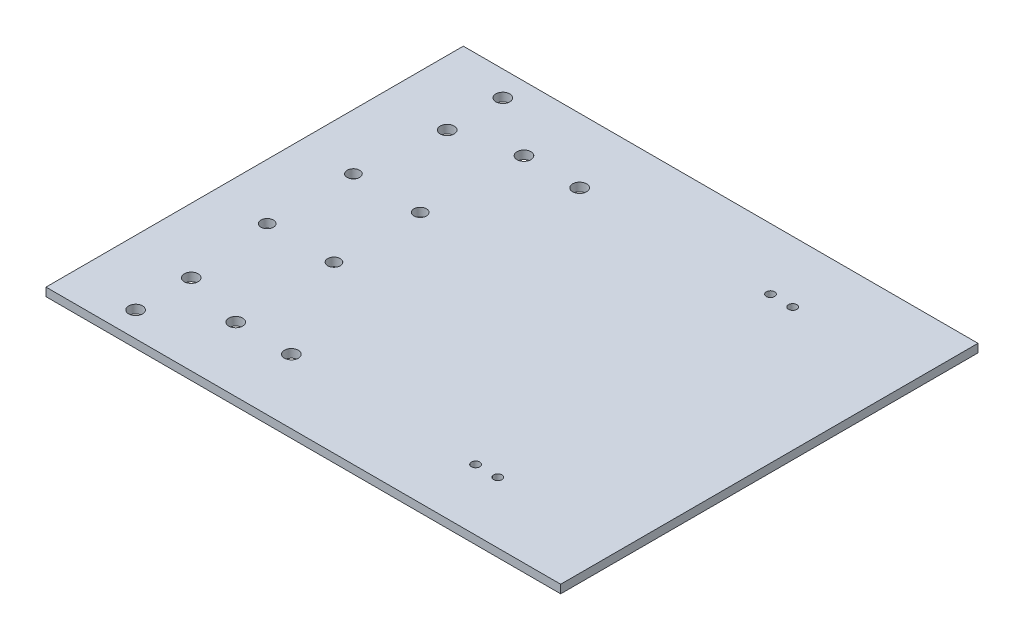
ISO-10303-21;
HEADER;
FILE_DESCRIPTION(('STEP AP214'),'2;1');
FILE_NAME('part.step','',(''),(''),'','','');
FILE_SCHEMA(('AUTOMOTIVE_DESIGN { 1 0 10303 214 1 1 1 1 }'));
ENDSEC;
DATA;
#1=APPLICATION_CONTEXT('core data for automotive mechanical design processes');
#2=APPLICATION_PROTOCOL_DEFINITION('international standard','automotive_design',2000,#1);
#3=PRODUCT_CONTEXT('',#1,'mechanical');
#4=PRODUCT('Part','Part','',(#3));
#5=PRODUCT_RELATED_PRODUCT_CATEGORY('part','',(#4));
#6=PRODUCT_DEFINITION_FORMATION('','',#4);
#7=PRODUCT_DEFINITION_CONTEXT('part definition',#1,'design');
#8=PRODUCT_DEFINITION('design','',#6,#7);
#9=PRODUCT_DEFINITION_SHAPE('','',#8);
#10=(LENGTH_UNIT() NAMED_UNIT(*) SI_UNIT(.MILLI.,.METRE.));
#11=(NAMED_UNIT(*) PLANE_ANGLE_UNIT() SI_UNIT($,.RADIAN.));
#12=(NAMED_UNIT(*) SI_UNIT($,.STERADIAN.) SOLID_ANGLE_UNIT());
#13=UNCERTAINTY_MEASURE_WITH_UNIT(LENGTH_MEASURE(1.E-05),#10,'distance_accuracy_value','');
#14=(GEOMETRIC_REPRESENTATION_CONTEXT(3) GLOBAL_UNCERTAINTY_ASSIGNED_CONTEXT((#13)) GLOBAL_UNIT_ASSIGNED_CONTEXT((#10,
#11,#12)) REPRESENTATION_CONTEXT('',''));
#15=CARTESIAN_POINT('',(0.,0.,0.));
#16=DIRECTION('',(0.,0.,1.));
#17=DIRECTION('',(1.,0.,0.));
#18=AXIS2_PLACEMENT_3D('',#15,#16,#17);
#19=CARTESIAN_POINT('',(0.,3.,0.));
#20=DIRECTION('',(1.,0.,0.));
#21=DIRECTION('',(0.,0.,-1.));
#22=AXIS2_PLACEMENT_3D('',#19,#20,#21);
#23=PLANE('',#22);
#24=DIRECTION('',(0.,0.,1.));
#25=VECTOR('',#24,1.);
#26=CARTESIAN_POINT('',(0.,0.,0.));
#27=LINE('',#26,#25);
#28=CARTESIAN_POINT('',(0.,0.,-150.));
#29=VERTEX_POINT('',#28);
#30=CARTESIAN_POINT('',(0.,0.,0.));
#31=VERTEX_POINT('',#30);
#32=EDGE_CURVE('E110',#29,#31,#27,.T.);
#33=ORIENTED_EDGE('',*,*,#32,.T.);
#34=DIRECTION('',(0.,-1.,0.));
#35=VECTOR('',#34,1.);
#36=CARTESIAN_POINT('',(0.,3.,0.));
#37=LINE('',#36,#35);
#38=CARTESIAN_POINT('',(0.,3.,0.));
#39=VERTEX_POINT('',#38);
#40=EDGE_CURVE('E11',#39,#31,#37,.T.);
#41=ORIENTED_EDGE('',*,*,#40,.F.);
#42=DIRECTION('',(0.,0.,1.));
#43=VECTOR('',#42,1.);
#44=CARTESIAN_POINT('',(0.,3.,0.));
#45=LINE('',#44,#43);
#46=CARTESIAN_POINT('',(0.,3.,-150.));
#47=VERTEX_POINT('',#46);
#48=EDGE_CURVE('E93',#47,#39,#45,.T.);
#49=ORIENTED_EDGE('',*,*,#48,.F.);
#50=DIRECTION('',(0.,-1.,0.));
#51=VECTOR('',#50,1.);
#52=CARTESIAN_POINT('',(0.,3.,-150.));
#53=LINE('',#52,#51);
#54=EDGE_CURVE('E106',#47,#29,#53,.T.);
#55=ORIENTED_EDGE('',*,*,#54,.T.);
#56=EDGE_LOOP('',(#33,#41,#49,#55));
#57=FACE_BOUND('',#56,.T.);
#58=ADVANCED_FACE('F39',(#57),#23,.F.);
#59=CARTESIAN_POINT('',(0.,3.,0.));
#60=DIRECTION('',(0.,0.,-1.));
#61=DIRECTION('',(-1.,0.,0.));
#62=AXIS2_PLACEMENT_3D('',#59,#60,#61);
#63=PLANE('',#62);
#64=DIRECTION('',(1.,0.,0.));
#65=VECTOR('',#64,1.);
#66=CARTESIAN_POINT('',(0.,0.,0.));
#67=LINE('',#66,#65);
#68=CARTESIAN_POINT('',(185.,0.,0.));
#69=VERTEX_POINT('',#68);
#70=EDGE_CURVE('E98',#31,#69,#67,.T.);
#71=ORIENTED_EDGE('',*,*,#70,.T.);
#72=DIRECTION('',(0.,-1.,0.));
#73=VECTOR('',#72,1.);
#74=CARTESIAN_POINT('',(185.,3.,0.));
#75=LINE('',#74,#73);
#76=CARTESIAN_POINT('',(185.,3.,0.));
#77=VERTEX_POINT('',#76);
#78=EDGE_CURVE('E49',#77,#69,#75,.T.);
#79=ORIENTED_EDGE('',*,*,#78,.F.);
#80=DIRECTION('',(1.,0.,0.));
#81=VECTOR('',#80,1.);
#82=CARTESIAN_POINT('',(0.,3.,0.));
#83=LINE('',#82,#81);
#84=EDGE_CURVE('E88',#39,#77,#83,.T.);
#85=ORIENTED_EDGE('',*,*,#84,.F.);
#86=ORIENTED_EDGE('',*,*,#40,.T.);
#87=EDGE_LOOP('',(#71,#79,#85,#86));
#88=FACE_BOUND('',#87,.T.);
#89=ADVANCED_FACE('F97',(#88),#63,.F.);
#90=CARTESIAN_POINT('',(185.,3.,0.));
#91=DIRECTION('',(-1.,0.,0.));
#92=DIRECTION('',(0.,0.,1.));
#93=AXIS2_PLACEMENT_3D('',#90,#91,#92);
#94=PLANE('',#93);
#95=DIRECTION('',(0.,0.,-1.));
#96=VECTOR('',#95,1.);
#97=CARTESIAN_POINT('',(185.,0.,0.));
#98=LINE('',#97,#96);
#99=CARTESIAN_POINT('',(185.,0.,-150.));
#100=VERTEX_POINT('',#99);
#101=EDGE_CURVE('E75',#69,#100,#98,.T.);
#102=ORIENTED_EDGE('',*,*,#101,.T.);
#103=DIRECTION('',(0.,-1.,0.));
#104=VECTOR('',#103,1.);
#105=CARTESIAN_POINT('',(185.,3.,-150.));
#106=LINE('',#105,#104);
#107=CARTESIAN_POINT('',(185.,3.,-150.));
#108=VERTEX_POINT('',#107);
#109=EDGE_CURVE('E100',#108,#100,#106,.T.);
#110=ORIENTED_EDGE('',*,*,#109,.F.);
#111=DIRECTION('',(0.,0.,-1.));
#112=VECTOR('',#111,1.);
#113=CARTESIAN_POINT('',(185.,3.,0.));
#114=LINE('',#113,#112);
#115=EDGE_CURVE('E91',#77,#108,#114,.T.);
#116=ORIENTED_EDGE('',*,*,#115,.F.);
#117=ORIENTED_EDGE('',*,*,#78,.T.);
#118=EDGE_LOOP('',(#102,#110,#116,#117));
#119=FACE_BOUND('',#118,.T.);
#120=ADVANCED_FACE('F102',(#119),#94,.F.);
#121=CARTESIAN_POINT('',(0.,3.,-150.));
#122=DIRECTION('',(0.,0.,1.));
#123=DIRECTION('',(1.,0.,0.));
#124=AXIS2_PLACEMENT_3D('',#121,#122,#123);
#125=PLANE('',#124);
#126=DIRECTION('',(-1.,0.,0.));
#127=VECTOR('',#126,1.);
#128=CARTESIAN_POINT('',(0.,0.,-150.));
#129=LINE('',#128,#127);
#130=EDGE_CURVE('E81',#100,#29,#129,.T.);
#131=ORIENTED_EDGE('',*,*,#130,.T.);
#132=ORIENTED_EDGE('',*,*,#54,.F.);
#133=DIRECTION('',(-1.,0.,0.));
#134=VECTOR('',#133,1.);
#135=CARTESIAN_POINT('',(0.,3.,-150.));
#136=LINE('',#135,#134);
#137=EDGE_CURVE('E58',#108,#47,#136,.T.);
#138=ORIENTED_EDGE('',*,*,#137,.F.);
#139=ORIENTED_EDGE('',*,*,#109,.T.);
#140=EDGE_LOOP('',(#131,#132,#138,#139));
#141=FACE_BOUND('',#140,.T.);
#142=ADVANCED_FACE('F228',(#141),#125,.F.);
#143=CARTESIAN_POINT('',(0.,3.,0.));
#144=DIRECTION('',(0.,-1.,0.));
#145=DIRECTION('',(0.,0.,-1.));
#146=AXIS2_PLACEMENT_3D('',#143,#144,#145);
#147=PLANE('',#146);
#148=CARTESIAN_POINT('',(44.,3.,-90.5));
#149=DIRECTION('',(0.,1.,0.));
#150=DIRECTION('',(0.,0.,1.));
#151=AXIS2_PLACEMENT_3D('',#148,#149,#150);
#152=CIRCLE('',#151,2.25);
#153=CARTESIAN_POINT('',(44.,3.,-88.25));
#154=VERTEX_POINT('',#153);
#155=EDGE_CURVE('E430',#154,#154,#152,.T.);
#156=ORIENTED_EDGE('',*,*,#155,.F.);
#157=EDGE_LOOP('',(#156));
#158=FACE_BOUND('',#157,.T.);
#159=CARTESIAN_POINT('',(44.,3.,-59.5));
#160=DIRECTION('',(0.,1.,0.));
#161=DIRECTION('',(0.,0.,-1.));
#162=AXIS2_PLACEMENT_3D('',#159,#160,#161);
#163=CIRCLE('',#162,2.25);
#164=CARTESIAN_POINT('',(44.,3.,-61.75));
#165=VERTEX_POINT('',#164);
#166=EDGE_CURVE('E427',#165,#165,#163,.T.);
#167=ORIENTED_EDGE('',*,*,#166,.F.);
#168=EDGE_LOOP('',(#167));
#169=FACE_BOUND('',#168,.T.);
#170=CARTESIAN_POINT('',(20.,3.,-59.5));
#171=DIRECTION('',(0.,1.,0.));
#172=DIRECTION('',(0.,0.,-1.));
#173=AXIS2_PLACEMENT_3D('',#170,#171,#172);
#174=CIRCLE('',#173,2.25);
#175=CARTESIAN_POINT('',(20.,3.,-61.75));
#176=VERTEX_POINT('',#175);
#177=EDGE_CURVE('E431',#176,#176,#174,.T.);
#178=ORIENTED_EDGE('',*,*,#177,.F.);
#179=EDGE_LOOP('',(#178));
#180=FACE_BOUND('',#179,.T.);
#181=CARTESIAN_POINT('',(45.,3.,-23.2));
#182=DIRECTION('',(0.,1.,0.));
#183=DIRECTION('',(0.,0.,1.));
#184=AXIS2_PLACEMENT_3D('',#181,#182,#183);
#185=CIRCLE('',#184,2.5);
#186=CARTESIAN_POINT('',(45.,3.,-20.7));
#187=VERTEX_POINT('',#186);
#188=EDGE_CURVE('E439',#187,#187,#185,.T.);
#189=ORIENTED_EDGE('',*,*,#188,.F.);
#190=EDGE_LOOP('',(#189));
#191=FACE_BOUND('',#190,.T.);
#192=CARTESIAN_POINT('',(132.4,3.,-128.));
#193=DIRECTION('',(0.,1.,0.));
#194=DIRECTION('',(0.,0.,1.));
#195=AXIS2_PLACEMENT_3D('',#192,#193,#194);
#196=CIRCLE('',#195,1.5);
#197=CARTESIAN_POINT('',(132.4,3.,-126.5));
#198=VERTEX_POINT('',#197);
#199=EDGE_CURVE('E451',#198,#198,#196,.T.);
#200=ORIENTED_EDGE('',*,*,#199,.F.);
#201=EDGE_LOOP('',(#200));
#202=FACE_BOUND('',#201,.T.);
#203=CARTESIAN_POINT('',(132.4,3.,-22.));
#204=DIRECTION('',(0.,1.,0.));
#205=DIRECTION('',(0.,0.,-1.));
#206=AXIS2_PLACEMENT_3D('',#203,#204,#205);
#207=CIRCLE('',#206,1.5);
#208=CARTESIAN_POINT('',(132.4,3.,-23.5));
#209=VERTEX_POINT('',#208);
#210=EDGE_CURVE('E447',#209,#209,#207,.T.);
#211=ORIENTED_EDGE('',*,*,#210,.F.);
#212=EDGE_LOOP('',(#211));
#213=FACE_BOUND('',#212,.T.);
#214=CARTESIAN_POINT('',(140.4,3.,-22.));
#215=DIRECTION('',(0.,1.,0.));
#216=DIRECTION('',(0.,0.,-1.));
#217=AXIS2_PLACEMENT_3D('',#214,#215,#216);
#218=CIRCLE('',#217,1.5);
#219=CARTESIAN_POINT('',(140.4,3.,-23.5));
#220=VERTEX_POINT('',#219);
#221=EDGE_CURVE('E443',#220,#220,#218,.T.);
#222=ORIENTED_EDGE('',*,*,#221,.F.);
#223=EDGE_LOOP('',(#222));
#224=FACE_BOUND('',#223,.T.);
#225=CARTESIAN_POINT('',(20.,3.,-90.5));
#226=DIRECTION('',(0.,1.,0.));
#227=DIRECTION('',(0.,0.,1.));
#228=AXIS2_PLACEMENT_3D('',#225,#226,#227);
#229=CIRCLE('',#228,2.25);
#230=CARTESIAN_POINT('',(20.,3.,-88.25));
#231=VERTEX_POINT('',#230);
#232=EDGE_CURVE('E436',#231,#231,#229,.T.);
#233=ORIENTED_EDGE('',*,*,#232,.F.);
#234=EDGE_LOOP('',(#233));
#235=FACE_BOUND('',#234,.T.);
#236=CARTESIAN_POINT('',(23.2,3.,-141.));
#237=DIRECTION('',(0.,1.,0.));
#238=DIRECTION('',(0.,0.,-1.));
#239=AXIS2_PLACEMENT_3D('',#236,#237,#238);
#240=CIRCLE('',#239,2.5);
#241=CARTESIAN_POINT('',(23.2,3.,-143.5));
#242=VERTEX_POINT('',#241);
#243=EDGE_CURVE('E475',#242,#242,#240,.T.);
#244=ORIENTED_EDGE('',*,*,#243,.F.);
#245=EDGE_LOOP('',(#244));
#246=FACE_BOUND('',#245,.T.);
#247=CARTESIAN_POINT('',(23.2,3.,-121.));
#248=DIRECTION('',(0.,1.,0.));
#249=DIRECTION('',(0.,0.,-1.));
#250=AXIS2_PLACEMENT_3D('',#247,#248,#249);
#251=CIRCLE('',#250,2.5);
#252=CARTESIAN_POINT('',(23.2,3.,-123.5));
#253=VERTEX_POINT('',#252);
#254=EDGE_CURVE('E479',#253,#253,#251,.T.);
#255=ORIENTED_EDGE('',*,*,#254,.F.);
#256=EDGE_LOOP('',(#255));
#257=FACE_BOUND('',#256,.T.);
#258=CARTESIAN_POINT('',(23.2,3.,-29.));
#259=DIRECTION('',(0.,1.,0.));
#260=DIRECTION('',(0.,0.,1.));
#261=AXIS2_PLACEMENT_3D('',#258,#259,#260);
#262=CIRCLE('',#261,2.5);
#263=CARTESIAN_POINT('',(23.2,3.,-26.5));
#264=VERTEX_POINT('',#263);
#265=EDGE_CURVE('E483',#264,#264,#262,.T.);
#266=ORIENTED_EDGE('',*,*,#265,.F.);
#267=EDGE_LOOP('',(#266));
#268=FACE_BOUND('',#267,.T.);
#269=CARTESIAN_POINT('',(45.,3.,-126.8));
#270=DIRECTION('',(0.,1.,0.));
#271=DIRECTION('',(0.,0.,-1.));
#272=AXIS2_PLACEMENT_3D('',#269,#270,#271);
#273=CIRCLE('',#272,2.5);
#274=CARTESIAN_POINT('',(45.,3.,-129.3));
#275=VERTEX_POINT('',#274);
#276=EDGE_CURVE('E487',#275,#275,#273,.T.);
#277=ORIENTED_EDGE('',*,*,#276,.F.);
#278=EDGE_LOOP('',(#277));
#279=FACE_BOUND('',#278,.T.);
#280=CARTESIAN_POINT('',(65.,3.,-126.8));
#281=DIRECTION('',(0.,1.,0.));
#282=DIRECTION('',(0.,0.,-1.));
#283=AXIS2_PLACEMENT_3D('',#280,#281,#282);
#284=CIRCLE('',#283,2.5);
#285=CARTESIAN_POINT('',(65.,3.,-129.3));
#286=VERTEX_POINT('',#285);
#287=EDGE_CURVE('E491',#286,#286,#284,.T.);
#288=ORIENTED_EDGE('',*,*,#287,.F.);
#289=EDGE_LOOP('',(#288));
#290=FACE_BOUND('',#289,.T.);
#291=CARTESIAN_POINT('',(23.2,3.,-9.00000000000001));
#292=DIRECTION('',(0.,1.,0.));
#293=DIRECTION('',(0.,0.,1.));
#294=AXIS2_PLACEMENT_3D('',#291,#292,#293);
#295=CIRCLE('',#294,2.5);
#296=CARTESIAN_POINT('',(23.2,3.,-6.50000000000001));
#297=VERTEX_POINT('',#296);
#298=EDGE_CURVE('E495',#297,#297,#295,.T.);
#299=ORIENTED_EDGE('',*,*,#298,.F.);
#300=EDGE_LOOP('',(#299));
#301=FACE_BOUND('',#300,.T.);
#302=CARTESIAN_POINT('',(65.,3.,-23.2));
#303=DIRECTION('',(0.,1.,0.));
#304=DIRECTION('',(0.,0.,1.));
#305=AXIS2_PLACEMENT_3D('',#302,#303,#304);
#306=CIRCLE('',#305,2.5);
#307=CARTESIAN_POINT('',(65.,3.,-20.7));
#308=VERTEX_POINT('',#307);
#309=EDGE_CURVE('E498',#308,#308,#306,.T.);
#310=ORIENTED_EDGE('',*,*,#309,.F.);
#311=EDGE_LOOP('',(#310));
#312=FACE_BOUND('',#311,.T.);
#313=CARTESIAN_POINT('',(140.4,3.,-128.));
#314=DIRECTION('',(0.,1.,0.));
#315=DIRECTION('',(0.,0.,1.));
#316=AXIS2_PLACEMENT_3D('',#313,#314,#315);
#317=CIRCLE('',#316,1.5);
#318=CARTESIAN_POINT('',(140.4,3.,-126.5));
#319=VERTEX_POINT('',#318);
#320=EDGE_CURVE('E129',#319,#319,#317,.T.);
#321=ORIENTED_EDGE('',*,*,#320,.F.);
#322=EDGE_LOOP('',(#321));
#323=FACE_BOUND('',#322,.T.);
#324=ORIENTED_EDGE('',*,*,#48,.T.);
#325=ORIENTED_EDGE('',*,*,#84,.T.);
#326=ORIENTED_EDGE('',*,*,#115,.T.);
#327=ORIENTED_EDGE('',*,*,#137,.T.);
#328=EDGE_LOOP('',(#324,#325,#326,#327));
#329=FACE_BOUND('',#328,.T.);
#330=ADVANCED_FACE('F89',(#158,#169,#180,#191,#202,#213,#224,#235,#246,#257,#268,#279,#290,#301,
#312,#323,#329),#147,.F.);
#331=CARTESIAN_POINT('',(0.,0.,0.));
#332=DIRECTION('',(0.,-1.,0.));
#333=DIRECTION('',(0.,0.,-1.));
#334=AXIS2_PLACEMENT_3D('',#331,#332,#333);
#335=PLANE('',#334);
#336=CARTESIAN_POINT('',(44.,0.,-90.5));
#337=DIRECTION('',(0.,-1.,0.));
#338=DIRECTION('',(0.,0.,-1.));
#339=AXIS2_PLACEMENT_3D('',#336,#337,#338);
#340=CIRCLE('',#339,2.25);
#341=CARTESIAN_POINT('',(44.,0.,-92.75));
#342=VERTEX_POINT('',#341);
#343=EDGE_CURVE('E42',#342,#342,#340,.T.);
#344=ORIENTED_EDGE('',*,*,#343,.F.);
#345=EDGE_LOOP('',(#344));
#346=FACE_BOUND('',#345,.T.);
#347=CARTESIAN_POINT('',(44.,0.,-59.5));
#348=DIRECTION('',(0.,-1.,0.));
#349=DIRECTION('',(0.,0.,-1.));
#350=AXIS2_PLACEMENT_3D('',#347,#348,#349);
#351=CIRCLE('',#350,2.25);
#352=CARTESIAN_POINT('',(44.,0.,-61.75));
#353=VERTEX_POINT('',#352);
#354=EDGE_CURVE('E180',#353,#353,#351,.T.);
#355=ORIENTED_EDGE('',*,*,#354,.F.);
#356=EDGE_LOOP('',(#355));
#357=FACE_BOUND('',#356,.T.);
#358=CARTESIAN_POINT('',(20.,0.,-59.5));
#359=DIRECTION('',(0.,-1.,0.));
#360=DIRECTION('',(0.,0.,-1.));
#361=AXIS2_PLACEMENT_3D('',#358,#359,#360);
#362=CIRCLE('',#361,2.25);
#363=CARTESIAN_POINT('',(20.,0.,-61.75));
#364=VERTEX_POINT('',#363);
#365=EDGE_CURVE('E177',#364,#364,#362,.T.);
#366=ORIENTED_EDGE('',*,*,#365,.F.);
#367=EDGE_LOOP('',(#366));
#368=FACE_BOUND('',#367,.T.);
#369=CARTESIAN_POINT('',(45.,0.,-23.2));
#370=DIRECTION('',(0.,-1.,0.));
#371=DIRECTION('',(0.,0.,-1.));
#372=AXIS2_PLACEMENT_3D('',#369,#370,#371);
#373=CIRCLE('',#372,2.5);
#374=CARTESIAN_POINT('',(45.,0.,-25.7));
#375=VERTEX_POINT('',#374);
#376=EDGE_CURVE('E173',#375,#375,#373,.T.);
#377=ORIENTED_EDGE('',*,*,#376,.F.);
#378=EDGE_LOOP('',(#377));
#379=FACE_BOUND('',#378,.T.);
#380=CARTESIAN_POINT('',(132.4,0.,-128.));
#381=DIRECTION('',(0.,-1.,0.));
#382=DIRECTION('',(0.,0.,-1.));
#383=AXIS2_PLACEMENT_3D('',#380,#381,#382);
#384=CIRCLE('',#383,1.5);
#385=CARTESIAN_POINT('',(132.4,0.,-129.5));
#386=VERTEX_POINT('',#385);
#387=EDGE_CURVE('E169',#386,#386,#384,.T.);
#388=ORIENTED_EDGE('',*,*,#387,.F.);
#389=EDGE_LOOP('',(#388));
#390=FACE_BOUND('',#389,.T.);
#391=CARTESIAN_POINT('',(132.4,0.,-22.));
#392=DIRECTION('',(0.,-1.,0.));
#393=DIRECTION('',(0.,0.,-1.));
#394=AXIS2_PLACEMENT_3D('',#391,#392,#393);
#395=CIRCLE('',#394,1.5);
#396=CARTESIAN_POINT('',(132.4,0.,-23.5));
#397=VERTEX_POINT('',#396);
#398=EDGE_CURVE('E165',#397,#397,#395,.T.);
#399=ORIENTED_EDGE('',*,*,#398,.F.);
#400=EDGE_LOOP('',(#399));
#401=FACE_BOUND('',#400,.T.);
#402=CARTESIAN_POINT('',(140.4,0.,-22.));
#403=DIRECTION('',(0.,-1.,0.));
#404=DIRECTION('',(0.,0.,-1.));
#405=AXIS2_PLACEMENT_3D('',#402,#403,#404);
#406=CIRCLE('',#405,1.5);
#407=CARTESIAN_POINT('',(140.4,0.,-23.5));
#408=VERTEX_POINT('',#407);
#409=EDGE_CURVE('E161',#408,#408,#406,.T.);
#410=ORIENTED_EDGE('',*,*,#409,.F.);
#411=EDGE_LOOP('',(#410));
#412=FACE_BOUND('',#411,.T.);
#413=CARTESIAN_POINT('',(20.,0.,-90.5));
#414=DIRECTION('',(0.,-1.,0.));
#415=DIRECTION('',(0.,0.,-1.));
#416=AXIS2_PLACEMENT_3D('',#413,#414,#415);
#417=CIRCLE('',#416,2.25);
#418=CARTESIAN_POINT('',(20.,0.,-92.75));
#419=VERTEX_POINT('',#418);
#420=EDGE_CURVE('E157',#419,#419,#417,.T.);
#421=ORIENTED_EDGE('',*,*,#420,.F.);
#422=EDGE_LOOP('',(#421));
#423=FACE_BOUND('',#422,.T.);
#424=CARTESIAN_POINT('',(23.2,0.,-141.));
#425=DIRECTION('',(0.,-1.,0.));
#426=DIRECTION('',(0.,0.,-1.));
#427=AXIS2_PLACEMENT_3D('',#424,#425,#426);
#428=CIRCLE('',#427,2.5);
#429=CARTESIAN_POINT('',(23.2,0.,-143.5));
#430=VERTEX_POINT('',#429);
#431=EDGE_CURVE('E153',#430,#430,#428,.T.);
#432=ORIENTED_EDGE('',*,*,#431,.F.);
#433=EDGE_LOOP('',(#432));
#434=FACE_BOUND('',#433,.T.);
#435=CARTESIAN_POINT('',(23.2,0.,-121.));
#436=DIRECTION('',(0.,-1.,0.));
#437=DIRECTION('',(0.,0.,-1.));
#438=AXIS2_PLACEMENT_3D('',#435,#436,#437);
#439=CIRCLE('',#438,2.5);
#440=CARTESIAN_POINT('',(23.2,0.,-123.5));
#441=VERTEX_POINT('',#440);
#442=EDGE_CURVE('E149',#441,#441,#439,.T.);
#443=ORIENTED_EDGE('',*,*,#442,.F.);
#444=EDGE_LOOP('',(#443));
#445=FACE_BOUND('',#444,.T.);
#446=CARTESIAN_POINT('',(23.2,0.,-29.));
#447=DIRECTION('',(0.,-1.,0.));
#448=DIRECTION('',(0.,0.,-1.));
#449=AXIS2_PLACEMENT_3D('',#446,#447,#448);
#450=CIRCLE('',#449,2.5);
#451=CARTESIAN_POINT('',(23.2,0.,-31.5));
#452=VERTEX_POINT('',#451);
#453=EDGE_CURVE('E145',#452,#452,#450,.T.);
#454=ORIENTED_EDGE('',*,*,#453,.F.);
#455=EDGE_LOOP('',(#454));
#456=FACE_BOUND('',#455,.T.);
#457=CARTESIAN_POINT('',(45.,0.,-126.8));
#458=DIRECTION('',(0.,-1.,0.));
#459=DIRECTION('',(0.,0.,-1.));
#460=AXIS2_PLACEMENT_3D('',#457,#458,#459);
#461=CIRCLE('',#460,2.5);
#462=CARTESIAN_POINT('',(45.,0.,-129.3));
#463=VERTEX_POINT('',#462);
#464=EDGE_CURVE('E141',#463,#463,#461,.T.);
#465=ORIENTED_EDGE('',*,*,#464,.F.);
#466=EDGE_LOOP('',(#465));
#467=FACE_BOUND('',#466,.T.);
#468=CARTESIAN_POINT('',(65.,0.,-126.8));
#469=DIRECTION('',(0.,-1.,0.));
#470=DIRECTION('',(0.,0.,-1.));
#471=AXIS2_PLACEMENT_3D('',#468,#469,#470);
#472=CIRCLE('',#471,2.5);
#473=CARTESIAN_POINT('',(65.,0.,-129.3));
#474=VERTEX_POINT('',#473);
#475=EDGE_CURVE('E137',#474,#474,#472,.T.);
#476=ORIENTED_EDGE('',*,*,#475,.F.);
#477=EDGE_LOOP('',(#476));
#478=FACE_BOUND('',#477,.T.);
#479=CARTESIAN_POINT('',(23.2,0.,-9.00000000000001));
#480=DIRECTION('',(0.,-1.,0.));
#481=DIRECTION('',(0.,0.,-1.));
#482=AXIS2_PLACEMENT_3D('',#479,#480,#481);
#483=CIRCLE('',#482,2.5);
#484=CARTESIAN_POINT('',(23.2,0.,-11.5));
#485=VERTEX_POINT('',#484);
#486=EDGE_CURVE('E133',#485,#485,#483,.T.);
#487=ORIENTED_EDGE('',*,*,#486,.F.);
#488=EDGE_LOOP('',(#487));
#489=FACE_BOUND('',#488,.T.);
#490=CARTESIAN_POINT('',(65.,0.,-23.2));
#491=DIRECTION('',(0.,-1.,0.));
#492=DIRECTION('',(0.,0.,-1.));
#493=AXIS2_PLACEMENT_3D('',#490,#491,#492);
#494=CIRCLE('',#493,2.5);
#495=CARTESIAN_POINT('',(65.,0.,-25.7));
#496=VERTEX_POINT('',#495);
#497=EDGE_CURVE('E128',#496,#496,#494,.T.);
#498=ORIENTED_EDGE('',*,*,#497,.F.);
#499=EDGE_LOOP('',(#498));
#500=FACE_BOUND('',#499,.T.);
#501=CARTESIAN_POINT('',(140.4,0.,-128.));
#502=DIRECTION('',(0.,-1.,0.));
#503=DIRECTION('',(0.,0.,-1.));
#504=AXIS2_PLACEMENT_3D('',#501,#502,#503);
#505=CIRCLE('',#504,1.5);
#506=CARTESIAN_POINT('',(140.4,0.,-129.5));
#507=VERTEX_POINT('',#506);
#508=EDGE_CURVE('E124',#507,#507,#505,.T.);
#509=ORIENTED_EDGE('',*,*,#508,.F.);
#510=EDGE_LOOP('',(#509));
#511=FACE_BOUND('',#510,.T.);
#512=ORIENTED_EDGE('',*,*,#32,.F.);
#513=ORIENTED_EDGE('',*,*,#130,.F.);
#514=ORIENTED_EDGE('',*,*,#101,.F.);
#515=ORIENTED_EDGE('',*,*,#70,.F.);
#516=EDGE_LOOP('',(#512,#513,#514,#515));
#517=FACE_BOUND('',#516,.T.);
#518=ADVANCED_FACE('F192',(#346,#357,#368,#379,#390,#401,#412,#423,#434,#445,#456,#467,#478,
#489,#500,#511,#517),#335,.T.);
#519=CARTESIAN_POINT('',(140.4,-7.,-128.));
#520=DIRECTION('',(0.,1.,0.));
#521=DIRECTION('',(0.,0.,1.));
#522=AXIS2_PLACEMENT_3D('',#519,#520,#521);
#523=CYLINDRICAL_SURFACE('',#522,1.5);
#524=ORIENTED_EDGE('',*,*,#508,.T.);
#525=EDGE_LOOP('',(#524));
#526=FACE_BOUND('',#525,.T.);
#527=ORIENTED_EDGE('',*,*,#320,.T.);
#528=EDGE_LOOP('',(#527));
#529=FACE_BOUND('',#528,.T.);
#530=ADVANCED_FACE('F195',(#526,#529),#523,.F.);
#531=CARTESIAN_POINT('',(65.,-7.,-23.2));
#532=DIRECTION('',(0.,1.,0.));
#533=DIRECTION('',(0.,0.,1.));
#534=AXIS2_PLACEMENT_3D('',#531,#532,#533);
#535=CYLINDRICAL_SURFACE('',#534,2.5);
#536=ORIENTED_EDGE('',*,*,#497,.T.);
#537=EDGE_LOOP('',(#536));
#538=FACE_BOUND('',#537,.T.);
#539=ORIENTED_EDGE('',*,*,#309,.T.);
#540=EDGE_LOOP('',(#539));
#541=FACE_BOUND('',#540,.T.);
#542=ADVANCED_FACE('F273',(#538,#541),#535,.F.);
#543=CARTESIAN_POINT('',(23.2,-7.,-9.00000000000001));
#544=DIRECTION('',(0.,1.,0.));
#545=DIRECTION('',(0.,0.,1.));
#546=AXIS2_PLACEMENT_3D('',#543,#544,#545);
#547=CYLINDRICAL_SURFACE('',#546,2.5);
#548=ORIENTED_EDGE('',*,*,#486,.T.);
#549=EDGE_LOOP('',(#548));
#550=FACE_BOUND('',#549,.T.);
#551=ORIENTED_EDGE('',*,*,#298,.T.);
#552=EDGE_LOOP('',(#551));
#553=FACE_BOUND('',#552,.T.);
#554=ADVANCED_FACE('F283',(#550,#553),#547,.F.);
#555=CARTESIAN_POINT('',(65.,-7.,-126.8));
#556=DIRECTION('',(0.,1.,0.));
#557=DIRECTION('',(0.,0.,1.));
#558=AXIS2_PLACEMENT_3D('',#555,#556,#557);
#559=CYLINDRICAL_SURFACE('',#558,2.5);
#560=ORIENTED_EDGE('',*,*,#475,.T.);
#561=EDGE_LOOP('',(#560));
#562=FACE_BOUND('',#561,.T.);
#563=ORIENTED_EDGE('',*,*,#287,.T.);
#564=EDGE_LOOP('',(#563));
#565=FACE_BOUND('',#564,.T.);
#566=ADVANCED_FACE('F293',(#562,#565),#559,.F.);
#567=CARTESIAN_POINT('',(45.,-7.,-126.8));
#568=DIRECTION('',(0.,1.,0.));
#569=DIRECTION('',(0.,0.,1.));
#570=AXIS2_PLACEMENT_3D('',#567,#568,#569);
#571=CYLINDRICAL_SURFACE('',#570,2.5);
#572=ORIENTED_EDGE('',*,*,#464,.T.);
#573=EDGE_LOOP('',(#572));
#574=FACE_BOUND('',#573,.T.);
#575=ORIENTED_EDGE('',*,*,#276,.T.);
#576=EDGE_LOOP('',(#575));
#577=FACE_BOUND('',#576,.T.);
#578=ADVANCED_FACE('F303',(#574,#577),#571,.F.);
#579=CARTESIAN_POINT('',(23.2,-7.,-29.));
#580=DIRECTION('',(0.,1.,0.));
#581=DIRECTION('',(0.,0.,1.));
#582=AXIS2_PLACEMENT_3D('',#579,#580,#581);
#583=CYLINDRICAL_SURFACE('',#582,2.5);
#584=ORIENTED_EDGE('',*,*,#453,.T.);
#585=EDGE_LOOP('',(#584));
#586=FACE_BOUND('',#585,.T.);
#587=ORIENTED_EDGE('',*,*,#265,.T.);
#588=EDGE_LOOP('',(#587));
#589=FACE_BOUND('',#588,.T.);
#590=ADVANCED_FACE('F313',(#586,#589),#583,.F.);
#591=CARTESIAN_POINT('',(23.2,-7.,-121.));
#592=DIRECTION('',(0.,1.,0.));
#593=DIRECTION('',(0.,0.,1.));
#594=AXIS2_PLACEMENT_3D('',#591,#592,#593);
#595=CYLINDRICAL_SURFACE('',#594,2.5);
#596=ORIENTED_EDGE('',*,*,#442,.T.);
#597=EDGE_LOOP('',(#596));
#598=FACE_BOUND('',#597,.T.);
#599=ORIENTED_EDGE('',*,*,#254,.T.);
#600=EDGE_LOOP('',(#599));
#601=FACE_BOUND('',#600,.T.);
#602=ADVANCED_FACE('F323',(#598,#601),#595,.F.);
#603=CARTESIAN_POINT('',(23.2,-7.,-141.));
#604=DIRECTION('',(0.,1.,0.));
#605=DIRECTION('',(0.,0.,1.));
#606=AXIS2_PLACEMENT_3D('',#603,#604,#605);
#607=CYLINDRICAL_SURFACE('',#606,2.5);
#608=ORIENTED_EDGE('',*,*,#431,.T.);
#609=EDGE_LOOP('',(#608));
#610=FACE_BOUND('',#609,.T.);
#611=ORIENTED_EDGE('',*,*,#243,.T.);
#612=EDGE_LOOP('',(#611));
#613=FACE_BOUND('',#612,.T.);
#614=ADVANCED_FACE('F333',(#610,#613),#607,.F.);
#615=CARTESIAN_POINT('',(20.,-7.,-90.5));
#616=DIRECTION('',(0.,1.,0.));
#617=DIRECTION('',(0.,0.,1.));
#618=AXIS2_PLACEMENT_3D('',#615,#616,#617);
#619=CYLINDRICAL_SURFACE('',#618,2.25);
#620=ORIENTED_EDGE('',*,*,#420,.T.);
#621=EDGE_LOOP('',(#620));
#622=FACE_BOUND('',#621,.T.);
#623=ORIENTED_EDGE('',*,*,#232,.T.);
#624=EDGE_LOOP('',(#623));
#625=FACE_BOUND('',#624,.T.);
#626=ADVANCED_FACE('F343',(#622,#625),#619,.F.);
#627=CARTESIAN_POINT('',(140.4,-7.,-22.));
#628=DIRECTION('',(0.,1.,0.));
#629=DIRECTION('',(0.,0.,1.));
#630=AXIS2_PLACEMENT_3D('',#627,#628,#629);
#631=CYLINDRICAL_SURFACE('',#630,1.5);
#632=ORIENTED_EDGE('',*,*,#409,.T.);
#633=EDGE_LOOP('',(#632));
#634=FACE_BOUND('',#633,.T.);
#635=ORIENTED_EDGE('',*,*,#221,.T.);
#636=EDGE_LOOP('',(#635));
#637=FACE_BOUND('',#636,.T.);
#638=ADVANCED_FACE('F353',(#634,#637),#631,.F.);
#639=CARTESIAN_POINT('',(132.4,-7.,-22.));
#640=DIRECTION('',(0.,1.,0.));
#641=DIRECTION('',(0.,0.,1.));
#642=AXIS2_PLACEMENT_3D('',#639,#640,#641);
#643=CYLINDRICAL_SURFACE('',#642,1.5);
#644=ORIENTED_EDGE('',*,*,#398,.T.);
#645=EDGE_LOOP('',(#644));
#646=FACE_BOUND('',#645,.T.);
#647=ORIENTED_EDGE('',*,*,#210,.T.);
#648=EDGE_LOOP('',(#647));
#649=FACE_BOUND('',#648,.T.);
#650=ADVANCED_FACE('F363',(#646,#649),#643,.F.);
#651=CARTESIAN_POINT('',(132.4,-7.,-128.));
#652=DIRECTION('',(0.,1.,0.));
#653=DIRECTION('',(0.,0.,1.));
#654=AXIS2_PLACEMENT_3D('',#651,#652,#653);
#655=CYLINDRICAL_SURFACE('',#654,1.5);
#656=ORIENTED_EDGE('',*,*,#387,.T.);
#657=EDGE_LOOP('',(#656));
#658=FACE_BOUND('',#657,.T.);
#659=ORIENTED_EDGE('',*,*,#199,.T.);
#660=EDGE_LOOP('',(#659));
#661=FACE_BOUND('',#660,.T.);
#662=ADVANCED_FACE('F373',(#658,#661),#655,.F.);
#663=CARTESIAN_POINT('',(45.,-7.,-23.2));
#664=DIRECTION('',(0.,1.,0.));
#665=DIRECTION('',(0.,0.,1.));
#666=AXIS2_PLACEMENT_3D('',#663,#664,#665);
#667=CYLINDRICAL_SURFACE('',#666,2.5);
#668=ORIENTED_EDGE('',*,*,#376,.T.);
#669=EDGE_LOOP('',(#668));
#670=FACE_BOUND('',#669,.T.);
#671=ORIENTED_EDGE('',*,*,#188,.T.);
#672=EDGE_LOOP('',(#671));
#673=FACE_BOUND('',#672,.T.);
#674=ADVANCED_FACE('F383',(#670,#673),#667,.F.);
#675=CARTESIAN_POINT('',(20.,-7.,-59.5));
#676=DIRECTION('',(0.,1.,0.));
#677=DIRECTION('',(0.,0.,1.));
#678=AXIS2_PLACEMENT_3D('',#675,#676,#677);
#679=CYLINDRICAL_SURFACE('',#678,2.25);
#680=ORIENTED_EDGE('',*,*,#365,.T.);
#681=EDGE_LOOP('',(#680));
#682=FACE_BOUND('',#681,.T.);
#683=ORIENTED_EDGE('',*,*,#177,.T.);
#684=EDGE_LOOP('',(#683));
#685=FACE_BOUND('',#684,.T.);
#686=ADVANCED_FACE('F393',(#682,#685),#679,.F.);
#687=CARTESIAN_POINT('',(44.,-7.,-59.5));
#688=DIRECTION('',(0.,1.,0.));
#689=DIRECTION('',(0.,0.,1.));
#690=AXIS2_PLACEMENT_3D('',#687,#688,#689);
#691=CYLINDRICAL_SURFACE('',#690,2.25);
#692=ORIENTED_EDGE('',*,*,#354,.T.);
#693=EDGE_LOOP('',(#692));
#694=FACE_BOUND('',#693,.T.);
#695=ORIENTED_EDGE('',*,*,#166,.T.);
#696=EDGE_LOOP('',(#695));
#697=FACE_BOUND('',#696,.T.);
#698=ADVANCED_FACE('F403',(#694,#697),#691,.F.);
#699=CARTESIAN_POINT('',(44.,-7.,-90.5));
#700=DIRECTION('',(0.,1.,0.));
#701=DIRECTION('',(0.,0.,1.));
#702=AXIS2_PLACEMENT_3D('',#699,#700,#701);
#703=CYLINDRICAL_SURFACE('',#702,2.25);
#704=ORIENTED_EDGE('',*,*,#343,.T.);
#705=EDGE_LOOP('',(#704));
#706=FACE_BOUND('',#705,.T.);
#707=ORIENTED_EDGE('',*,*,#155,.T.);
#708=EDGE_LOOP('',(#707));
#709=FACE_BOUND('',#708,.T.);
#710=ADVANCED_FACE('F189',(#706,#709),#703,.F.);
#711=CLOSED_SHELL('',(#58,#89,#120,#142,#330,#518,#530,#542,#554,#566,#578,#590,#602,#614,#626,
#638,#650,#662,#674,#686,#698,#710));
#712=MANIFOLD_SOLID_BREP('B2',#711);
#713=ADVANCED_BREP_SHAPE_REPRESENTATION('',(#18,#712),#14);
#714=SHAPE_DEFINITION_REPRESENTATION(#9,#713);
ENDSEC;
END-ISO-10303-21;
